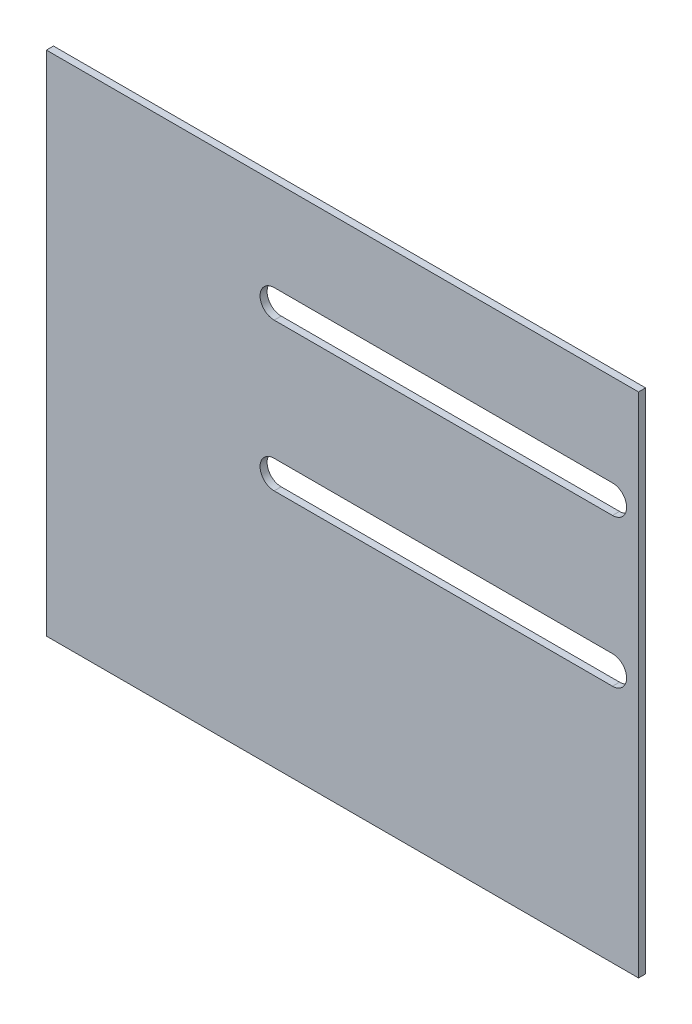
ISO-10303-21;
HEADER;
FILE_DESCRIPTION(('STEP AP214'),'2;1');
FILE_NAME('part.step','',(''),(''),'','','');
FILE_SCHEMA(('AUTOMOTIVE_DESIGN { 1 0 10303 214 1 1 1 1 }'));
ENDSEC;
DATA;
#1=APPLICATION_CONTEXT('core data for automotive mechanical design processes');
#2=APPLICATION_PROTOCOL_DEFINITION('international standard','automotive_design',2000,#1);
#3=PRODUCT_CONTEXT('',#1,'mechanical');
#4=PRODUCT('Part','Part','',(#3));
#5=PRODUCT_RELATED_PRODUCT_CATEGORY('part','',(#4));
#6=PRODUCT_DEFINITION_FORMATION('','',#4);
#7=PRODUCT_DEFINITION_CONTEXT('part definition',#1,'design');
#8=PRODUCT_DEFINITION('design','',#6,#7);
#9=PRODUCT_DEFINITION_SHAPE('','',#8);
#10=(LENGTH_UNIT() NAMED_UNIT(*) SI_UNIT(.MILLI.,.METRE.));
#11=(NAMED_UNIT(*) PLANE_ANGLE_UNIT() SI_UNIT($,.RADIAN.));
#12=(NAMED_UNIT(*) SI_UNIT($,.STERADIAN.) SOLID_ANGLE_UNIT());
#13=UNCERTAINTY_MEASURE_WITH_UNIT(LENGTH_MEASURE(1.E-05),#10,'distance_accuracy_value','');
#14=(GEOMETRIC_REPRESENTATION_CONTEXT(3) GLOBAL_UNCERTAINTY_ASSIGNED_CONTEXT((#13)) GLOBAL_UNIT_ASSIGNED_CONTEXT((#10,
#11,#12)) REPRESENTATION_CONTEXT('',''));
#15=CARTESIAN_POINT('',(0.,0.,0.));
#16=DIRECTION('',(0.,0.,1.));
#17=DIRECTION('',(1.,0.,0.));
#18=AXIS2_PLACEMENT_3D('',#15,#16,#17);
#19=CARTESIAN_POINT('',(0.,0.,6.35));
#20=DIRECTION('',(0.,0.,-1.));
#21=DIRECTION('',(-1.,0.,0.));
#22=AXIS2_PLACEMENT_3D('',#19,#20,#21);
#23=PLANE('',#22);
#24=CARTESIAN_POINT('',(-61.5480475102231,133.202211593084,6.35));
#25=DIRECTION('',(0.,0.,1.));
#26=DIRECTION('',(1.,0.,0.));
#27=AXIS2_PLACEMENT_3D('',#24,#25,#26);
#28=CIRCLE('',#27,12.7);
#29=CARTESIAN_POINT('',(-61.5480475102231,145.902211593084,6.35));
#30=VERTEX_POINT('',#29);
#31=CARTESIAN_POINT('',(-61.5480475102231,120.502211593084,6.35));
#32=VERTEX_POINT('',#31);
#33=EDGE_CURVE('E210',#30,#32,#28,.T.);
#34=ORIENTED_EDGE('',*,*,#33,.F.);
#35=DIRECTION('',(1.,0.,0.));
#36=VECTOR('',#35,1.);
#37=CARTESIAN_POINT('',(-61.5480475102231,145.902211593084,6.35));
#38=LINE('',#37,#36);
#39=CARTESIAN_POINT('',(243.251952489777,145.902211593084,6.35));
#40=VERTEX_POINT('',#39);
#41=EDGE_CURVE('E218',#30,#40,#38,.T.);
#42=ORIENTED_EDGE('',*,*,#41,.T.);
#43=CARTESIAN_POINT('',(243.251952489777,133.202211593084,6.35));
#44=DIRECTION('',(0.,0.,1.));
#45=DIRECTION('',(1.,0.,0.));
#46=AXIS2_PLACEMENT_3D('',#43,#44,#45);
#47=CIRCLE('',#46,12.7);
#48=CARTESIAN_POINT('',(243.251952489777,120.502211593084,6.35));
#49=VERTEX_POINT('',#48);
#50=EDGE_CURVE('E215',#49,#40,#47,.T.);
#51=ORIENTED_EDGE('',*,*,#50,.F.);
#52=DIRECTION('',(1.,0.,0.));
#53=VECTOR('',#52,1.);
#54=CARTESIAN_POINT('',(-61.5480475102231,120.502211593084,6.35));
#55=LINE('',#54,#53);
#56=EDGE_CURVE('E212',#32,#49,#55,.T.);
#57=ORIENTED_EDGE('',*,*,#56,.F.);
#58=EDGE_LOOP('',(#34,#42,#51,#57));
#59=FACE_BOUND('',#58,.T.);
#60=DIRECTION('',(1.,0.,0.));
#61=VECTOR('',#60,1.);
#62=CARTESIAN_POINT('',(-266.7,-228.6,6.35));
#63=LINE('',#62,#61);
#64=CARTESIAN_POINT('',(-266.7,-228.6,6.35));
#65=VERTEX_POINT('',#64);
#66=CARTESIAN_POINT('',(266.7,-228.6,6.35));
#67=VERTEX_POINT('',#66);
#68=EDGE_CURVE('E242',#65,#67,#63,.T.);
#69=ORIENTED_EDGE('',*,*,#68,.T.);
#70=DIRECTION('',(0.,-1.,0.));
#71=VECTOR('',#70,1.);
#72=CARTESIAN_POINT('',(266.7,228.6,6.35));
#73=LINE('',#72,#71);
#74=CARTESIAN_POINT('',(266.7,228.6,6.35));
#75=VERTEX_POINT('',#74);
#76=EDGE_CURVE('E244',#75,#67,#73,.T.);
#77=ORIENTED_EDGE('',*,*,#76,.F.);
#78=DIRECTION('',(1.,0.,0.));
#79=VECTOR('',#78,1.);
#80=CARTESIAN_POINT('',(-266.7,228.6,6.35));
#81=LINE('',#80,#79);
#82=CARTESIAN_POINT('',(-266.7,228.6,6.35));
#83=VERTEX_POINT('',#82);
#84=EDGE_CURVE('E248',#83,#75,#81,.T.);
#85=ORIENTED_EDGE('',*,*,#84,.F.);
#86=DIRECTION('',(0.,-1.,0.));
#87=VECTOR('',#86,1.);
#88=CARTESIAN_POINT('',(-266.7,228.6,6.35));
#89=LINE('',#88,#87);
#90=EDGE_CURVE('E251',#83,#65,#89,.T.);
#91=ORIENTED_EDGE('',*,*,#90,.T.);
#92=EDGE_LOOP('',(#69,#77,#85,#91));
#93=FACE_BOUND('',#92,.T.);
#94=CARTESIAN_POINT('',(-61.5480475102231,0.,6.35));
#95=DIRECTION('',(0.,0.,1.));
#96=DIRECTION('',(1.,0.,0.));
#97=AXIS2_PLACEMENT_3D('',#94,#95,#96);
#98=CIRCLE('',#97,12.7);
#99=CARTESIAN_POINT('',(-61.5480475102231,12.7,6.35));
#100=VERTEX_POINT('',#99);
#101=CARTESIAN_POINT('',(-61.5480475102231,-12.7,6.35));
#102=VERTEX_POINT('',#101);
#103=EDGE_CURVE('E175',#100,#102,#98,.T.);
#104=ORIENTED_EDGE('',*,*,#103,.F.);
#105=DIRECTION('',(1.,0.,0.));
#106=VECTOR('',#105,1.);
#107=CARTESIAN_POINT('',(-61.5480475102231,12.7,6.35));
#108=LINE('',#107,#106);
#109=CARTESIAN_POINT('',(243.251952489777,12.7,6.35));
#110=VERTEX_POINT('',#109);
#111=EDGE_CURVE('E197',#100,#110,#108,.T.);
#112=ORIENTED_EDGE('',*,*,#111,.T.);
#113=CARTESIAN_POINT('',(243.251952489777,0.,6.35));
#114=DIRECTION('',(0.,0.,1.));
#115=DIRECTION('',(1.,0.,0.));
#116=AXIS2_PLACEMENT_3D('',#113,#114,#115);
#117=CIRCLE('',#116,12.7);
#118=CARTESIAN_POINT('',(243.251952489777,-12.7,6.35));
#119=VERTEX_POINT('',#118);
#120=EDGE_CURVE('E195',#119,#110,#117,.T.);
#121=ORIENTED_EDGE('',*,*,#120,.F.);
#122=DIRECTION('',(1.,0.,0.));
#123=VECTOR('',#122,1.);
#124=CARTESIAN_POINT('',(-61.5480475102231,-12.7,6.35));
#125=LINE('',#124,#123);
#126=EDGE_CURVE('E183',#102,#119,#125,.T.);
#127=ORIENTED_EDGE('',*,*,#126,.F.);
#128=EDGE_LOOP('',(#104,#112,#121,#127));
#129=FACE_BOUND('',#128,.T.);
#130=ADVANCED_FACE('F87',(#59,#93,#129),#23,.F.);
#131=CARTESIAN_POINT('',(0.,0.,0.));
#132=DIRECTION('',(0.,0.,-1.));
#133=DIRECTION('',(-1.,0.,0.));
#134=AXIS2_PLACEMENT_3D('',#131,#132,#133);
#135=PLANE('',#134);
#136=DIRECTION('',(1.,0.,0.));
#137=VECTOR('',#136,1.);
#138=CARTESIAN_POINT('',(-266.7,-228.6,0.));
#139=LINE('',#138,#137);
#140=CARTESIAN_POINT('',(-266.7,-228.6,0.));
#141=VERTEX_POINT('',#140);
#142=CARTESIAN_POINT('',(266.7,-228.6,0.));
#143=VERTEX_POINT('',#142);
#144=EDGE_CURVE('E241',#141,#143,#139,.T.);
#145=ORIENTED_EDGE('',*,*,#144,.F.);
#146=DIRECTION('',(0.,-1.,0.));
#147=VECTOR('',#146,1.);
#148=CARTESIAN_POINT('',(-266.7,228.6,0.));
#149=LINE('',#148,#147);
#150=CARTESIAN_POINT('',(-266.7,228.6,0.));
#151=VERTEX_POINT('',#150);
#152=EDGE_CURVE('E245',#151,#141,#149,.T.);
#153=ORIENTED_EDGE('',*,*,#152,.F.);
#154=DIRECTION('',(1.,0.,0.));
#155=VECTOR('',#154,1.);
#156=CARTESIAN_POINT('',(-266.7,228.6,0.));
#157=LINE('',#156,#155);
#158=CARTESIAN_POINT('',(266.7,228.6,0.));
#159=VERTEX_POINT('',#158);
#160=EDGE_CURVE('E259',#151,#159,#157,.T.);
#161=ORIENTED_EDGE('',*,*,#160,.T.);
#162=DIRECTION('',(0.,-1.,0.));
#163=VECTOR('',#162,1.);
#164=CARTESIAN_POINT('',(266.7,228.6,0.));
#165=LINE('',#164,#163);
#166=EDGE_CURVE('E256',#159,#143,#165,.T.);
#167=ORIENTED_EDGE('',*,*,#166,.T.);
#168=EDGE_LOOP('',(#145,#153,#161,#167));
#169=FACE_BOUND('',#168,.T.);
#170=DIRECTION('',(1.,0.,0.));
#171=VECTOR('',#170,1.);
#172=CARTESIAN_POINT('',(-61.5480475102231,145.902211593084,0.));
#173=LINE('',#172,#171);
#174=CARTESIAN_POINT('',(-61.5480475102231,145.902211593084,0.));
#175=VERTEX_POINT('',#174);
#176=CARTESIAN_POINT('',(243.251952489777,145.902211593084,0.));
#177=VERTEX_POINT('',#176);
#178=EDGE_CURVE('E213',#175,#177,#173,.T.);
#179=ORIENTED_EDGE('',*,*,#178,.F.);
#180=CARTESIAN_POINT('',(-61.5480475102231,133.202211593084,0.));
#181=DIRECTION('',(0.,0.,1.));
#182=DIRECTION('',(1.,0.,0.));
#183=AXIS2_PLACEMENT_3D('',#180,#181,#182);
#184=CIRCLE('',#183,12.7);
#185=CARTESIAN_POINT('',(-61.5480475102231,120.502211593084,0.));
#186=VERTEX_POINT('',#185);
#187=EDGE_CURVE('E191',#175,#186,#184,.T.);
#188=ORIENTED_EDGE('',*,*,#187,.T.);
#189=DIRECTION('',(1.,0.,0.));
#190=VECTOR('',#189,1.);
#191=CARTESIAN_POINT('',(-61.5480475102231,120.502211593084,0.));
#192=LINE('',#191,#190);
#193=CARTESIAN_POINT('',(243.251952489777,120.502211593084,0.));
#194=VERTEX_POINT('',#193);
#195=EDGE_CURVE('E224',#186,#194,#192,.T.);
#196=ORIENTED_EDGE('',*,*,#195,.T.);
#197=CARTESIAN_POINT('',(243.251952489777,133.202211593084,0.));
#198=DIRECTION('',(0.,0.,1.));
#199=DIRECTION('',(1.,0.,0.));
#200=AXIS2_PLACEMENT_3D('',#197,#198,#199);
#201=CIRCLE('',#200,12.7);
#202=EDGE_CURVE('E227',#194,#177,#201,.T.);
#203=ORIENTED_EDGE('',*,*,#202,.T.);
#204=EDGE_LOOP('',(#179,#188,#196,#203));
#205=FACE_BOUND('',#204,.T.);
#206=DIRECTION('',(1.,0.,0.));
#207=VECTOR('',#206,1.);
#208=CARTESIAN_POINT('',(-61.5480475102231,12.7,0.));
#209=LINE('',#208,#207);
#210=CARTESIAN_POINT('',(-61.5480475102231,12.7,0.));
#211=VERTEX_POINT('',#210);
#212=CARTESIAN_POINT('',(243.251952489777,12.7,0.));
#213=VERTEX_POINT('',#212);
#214=EDGE_CURVE('E184',#211,#213,#209,.T.);
#215=ORIENTED_EDGE('',*,*,#214,.F.);
#216=CARTESIAN_POINT('',(-61.5480475102231,0.,0.));
#217=DIRECTION('',(0.,0.,1.));
#218=DIRECTION('',(1.,0.,0.));
#219=AXIS2_PLACEMENT_3D('',#216,#217,#218);
#220=CIRCLE('',#219,12.7);
#221=CARTESIAN_POINT('',(-61.5480475102231,-12.7,0.));
#222=VERTEX_POINT('',#221);
#223=EDGE_CURVE('E110',#211,#222,#220,.T.);
#224=ORIENTED_EDGE('',*,*,#223,.T.);
#225=DIRECTION('',(1.,0.,0.));
#226=VECTOR('',#225,1.);
#227=CARTESIAN_POINT('',(-61.5480475102231,-12.7,0.));
#228=LINE('',#227,#226);
#229=CARTESIAN_POINT('',(243.251952489777,-12.7,0.));
#230=VERTEX_POINT('',#229);
#231=EDGE_CURVE('E190',#222,#230,#228,.T.);
#232=ORIENTED_EDGE('',*,*,#231,.T.);
#233=CARTESIAN_POINT('',(243.251952489777,0.,0.));
#234=DIRECTION('',(0.,0.,1.));
#235=DIRECTION('',(1.,0.,0.));
#236=AXIS2_PLACEMENT_3D('',#233,#234,#235);
#237=CIRCLE('',#236,12.7);
#238=EDGE_CURVE('E203',#230,#213,#237,.T.);
#239=ORIENTED_EDGE('',*,*,#238,.T.);
#240=EDGE_LOOP('',(#215,#224,#232,#239));
#241=FACE_BOUND('',#240,.T.);
#242=ADVANCED_FACE('F278',(#169,#205,#241),#135,.T.);
#243=CARTESIAN_POINT('',(-266.7,-228.6,6.35));
#244=DIRECTION('',(0.,1.,0.));
#245=DIRECTION('',(-1.,0.,0.));
#246=AXIS2_PLACEMENT_3D('',#243,#244,#245);
#247=PLANE('',#246);
#248=ORIENTED_EDGE('',*,*,#144,.T.);
#249=DIRECTION('',(0.,0.,-1.));
#250=VECTOR('',#249,1.);
#251=CARTESIAN_POINT('',(266.7,-228.6,6.35));
#252=LINE('',#251,#250);
#253=EDGE_CURVE('E12',#67,#143,#252,.T.);
#254=ORIENTED_EDGE('',*,*,#253,.F.);
#255=ORIENTED_EDGE('',*,*,#68,.F.);
#256=DIRECTION('',(0.,0.,-1.));
#257=VECTOR('',#256,1.);
#258=CARTESIAN_POINT('',(-266.7,-228.6,6.35));
#259=LINE('',#258,#257);
#260=EDGE_CURVE('E253',#65,#141,#259,.T.);
#261=ORIENTED_EDGE('',*,*,#260,.T.);
#262=EDGE_LOOP('',(#248,#254,#255,#261));
#263=FACE_BOUND('',#262,.T.);
#264=ADVANCED_FACE('F89',(#263),#247,.F.);
#265=CARTESIAN_POINT('',(266.7,228.6,6.35));
#266=DIRECTION('',(1.,0.,0.));
#267=DIRECTION('',(0.,1.,0.));
#268=AXIS2_PLACEMENT_3D('',#265,#266,#267);
#269=PLANE('',#268);
#270=ORIENTED_EDGE('',*,*,#166,.F.);
#271=DIRECTION('',(0.,0.,-1.));
#272=VECTOR('',#271,1.);
#273=CARTESIAN_POINT('',(266.7,228.6,6.35));
#274=LINE('',#273,#272);
#275=EDGE_CURVE('E95',#75,#159,#274,.T.);
#276=ORIENTED_EDGE('',*,*,#275,.F.);
#277=ORIENTED_EDGE('',*,*,#76,.T.);
#278=ORIENTED_EDGE('',*,*,#253,.T.);
#279=EDGE_LOOP('',(#270,#276,#277,#278));
#280=FACE_BOUND('',#279,.T.);
#281=ADVANCED_FACE('F273',(#280),#269,.T.);
#282=CARTESIAN_POINT('',(-266.7,228.6,6.35));
#283=DIRECTION('',(0.,1.,0.));
#284=DIRECTION('',(-1.,0.,0.));
#285=AXIS2_PLACEMENT_3D('',#282,#283,#284);
#286=PLANE('',#285);
#287=ORIENTED_EDGE('',*,*,#160,.F.);
#288=DIRECTION('',(0.,0.,-1.));
#289=VECTOR('',#288,1.);
#290=CARTESIAN_POINT('',(-266.7,228.6,6.35));
#291=LINE('',#290,#289);
#292=EDGE_CURVE('E265',#83,#151,#291,.T.);
#293=ORIENTED_EDGE('',*,*,#292,.F.);
#294=ORIENTED_EDGE('',*,*,#84,.T.);
#295=ORIENTED_EDGE('',*,*,#275,.T.);
#296=EDGE_LOOP('',(#287,#293,#294,#295));
#297=FACE_BOUND('',#296,.T.);
#298=ADVANCED_FACE('F269',(#297),#286,.T.);
#299=CARTESIAN_POINT('',(-266.7,228.6,6.35));
#300=DIRECTION('',(1.,0.,0.));
#301=DIRECTION('',(0.,1.,0.));
#302=AXIS2_PLACEMENT_3D('',#299,#300,#301);
#303=PLANE('',#302);
#304=ORIENTED_EDGE('',*,*,#152,.T.);
#305=ORIENTED_EDGE('',*,*,#260,.F.);
#306=ORIENTED_EDGE('',*,*,#90,.F.);
#307=ORIENTED_EDGE('',*,*,#292,.T.);
#308=EDGE_LOOP('',(#304,#305,#306,#307));
#309=FACE_BOUND('',#308,.T.);
#310=ADVANCED_FACE('F282',(#309),#303,.F.);
#311=CARTESIAN_POINT('',(-61.5480475102231,133.202211593084,6.35));
#312=DIRECTION('',(0.,0.,-1.));
#313=DIRECTION('',(-1.,0.,0.));
#314=AXIS2_PLACEMENT_3D('',#311,#312,#313);
#315=CYLINDRICAL_SURFACE('',#314,12.7);
#316=ORIENTED_EDGE('',*,*,#187,.F.);
#317=DIRECTION('',(0.,0.,-1.));
#318=VECTOR('',#317,1.);
#319=CARTESIAN_POINT('',(-61.5480475102231,145.902211593084,6.35));
#320=LINE('',#319,#318);
#321=EDGE_CURVE('E221',#30,#175,#320,.T.);
#322=ORIENTED_EDGE('',*,*,#321,.F.);
#323=ORIENTED_EDGE('',*,*,#33,.T.);
#324=DIRECTION('',(0.,0.,-1.));
#325=VECTOR('',#324,1.);
#326=CARTESIAN_POINT('',(-61.5480475102231,120.502211593084,6.35));
#327=LINE('',#326,#325);
#328=EDGE_CURVE('E238',#32,#186,#327,.T.);
#329=ORIENTED_EDGE('',*,*,#328,.T.);
#330=EDGE_LOOP('',(#316,#322,#323,#329));
#331=FACE_BOUND('',#330,.T.);
#332=ADVANCED_FACE('F296',(#331),#315,.F.);
#333=CARTESIAN_POINT('',(-61.5480475102231,120.502211593084,6.35));
#334=DIRECTION('',(0.,1.,0.));
#335=DIRECTION('',(0.,0.,1.));
#336=AXIS2_PLACEMENT_3D('',#333,#334,#335);
#337=PLANE('',#336);
#338=ORIENTED_EDGE('',*,*,#195,.F.);
#339=ORIENTED_EDGE('',*,*,#328,.F.);
#340=ORIENTED_EDGE('',*,*,#56,.T.);
#341=DIRECTION('',(0.,0.,-1.));
#342=VECTOR('',#341,1.);
#343=CARTESIAN_POINT('',(243.251952489777,120.502211593084,6.35));
#344=LINE('',#343,#342);
#345=EDGE_CURVE('E236',#49,#194,#344,.T.);
#346=ORIENTED_EDGE('',*,*,#345,.T.);
#347=EDGE_LOOP('',(#338,#339,#340,#346));
#348=FACE_BOUND('',#347,.T.);
#349=ADVANCED_FACE('F341',(#348),#337,.T.);
#350=CARTESIAN_POINT('',(243.251952489777,133.202211593084,6.35));
#351=DIRECTION('',(0.,0.,-1.));
#352=DIRECTION('',(-1.,0.,0.));
#353=AXIS2_PLACEMENT_3D('',#350,#351,#352);
#354=CYLINDRICAL_SURFACE('',#353,12.7);
#355=ORIENTED_EDGE('',*,*,#202,.F.);
#356=ORIENTED_EDGE('',*,*,#345,.F.);
#357=ORIENTED_EDGE('',*,*,#50,.T.);
#358=DIRECTION('',(0.,0.,-1.));
#359=VECTOR('',#358,1.);
#360=CARTESIAN_POINT('',(243.251952489777,145.902211593084,6.35));
#361=LINE('',#360,#359);
#362=EDGE_CURVE('E234',#40,#177,#361,.T.);
#363=ORIENTED_EDGE('',*,*,#362,.T.);
#364=EDGE_LOOP('',(#355,#356,#357,#363));
#365=FACE_BOUND('',#364,.T.);
#366=ADVANCED_FACE('F349',(#365),#354,.F.);
#367=CARTESIAN_POINT('',(-61.5480475102231,145.902211593084,6.35));
#368=DIRECTION('',(0.,1.,0.));
#369=DIRECTION('',(0.,0.,1.));
#370=AXIS2_PLACEMENT_3D('',#367,#368,#369);
#371=PLANE('',#370);
#372=ORIENTED_EDGE('',*,*,#178,.T.);
#373=ORIENTED_EDGE('',*,*,#362,.F.);
#374=ORIENTED_EDGE('',*,*,#41,.F.);
#375=ORIENTED_EDGE('',*,*,#321,.T.);
#376=EDGE_LOOP('',(#372,#373,#374,#375));
#377=FACE_BOUND('',#376,.T.);
#378=ADVANCED_FACE('F357',(#377),#371,.F.);
#379=CARTESIAN_POINT('',(-61.5480475102231,0.,6.35));
#380=DIRECTION('',(0.,0.,-1.));
#381=DIRECTION('',(-1.,0.,0.));
#382=AXIS2_PLACEMENT_3D('',#379,#380,#381);
#383=CYLINDRICAL_SURFACE('',#382,12.7);
#384=ORIENTED_EDGE('',*,*,#223,.F.);
#385=DIRECTION('',(0.,0.,-1.));
#386=VECTOR('',#385,1.);
#387=CARTESIAN_POINT('',(-61.5480475102231,12.7,6.35));
#388=LINE('',#387,#386);
#389=EDGE_CURVE('E179',#100,#211,#388,.T.);
#390=ORIENTED_EDGE('',*,*,#389,.F.);
#391=ORIENTED_EDGE('',*,*,#103,.T.);
#392=DIRECTION('',(0.,0.,-1.));
#393=VECTOR('',#392,1.);
#394=CARTESIAN_POINT('',(-61.5480475102231,-12.7,6.35));
#395=LINE('',#394,#393);
#396=EDGE_CURVE('E178',#102,#222,#395,.T.);
#397=ORIENTED_EDGE('',*,*,#396,.T.);
#398=EDGE_LOOP('',(#384,#390,#391,#397));
#399=FACE_BOUND('',#398,.T.);
#400=ADVANCED_FACE('F177',(#399),#383,.F.);
#401=CARTESIAN_POINT('',(-61.5480475102231,-12.7,6.35));
#402=DIRECTION('',(0.,1.,0.));
#403=DIRECTION('',(-1.,0.,0.));
#404=AXIS2_PLACEMENT_3D('',#401,#402,#403);
#405=PLANE('',#404);
#406=ORIENTED_EDGE('',*,*,#231,.F.);
#407=ORIENTED_EDGE('',*,*,#396,.F.);
#408=ORIENTED_EDGE('',*,*,#126,.T.);
#409=DIRECTION('',(0.,0.,-1.));
#410=VECTOR('',#409,1.);
#411=CARTESIAN_POINT('',(243.251952489777,-12.7,6.35));
#412=LINE('',#411,#410);
#413=EDGE_CURVE('E192',#119,#230,#412,.T.);
#414=ORIENTED_EDGE('',*,*,#413,.T.);
#415=EDGE_LOOP('',(#406,#407,#408,#414));
#416=FACE_BOUND('',#415,.T.);
#417=ADVANCED_FACE('F187',(#416),#405,.T.);
#418=CARTESIAN_POINT('',(243.251952489777,0.,6.35));
#419=DIRECTION('',(0.,0.,-1.));
#420=DIRECTION('',(-1.,0.,0.));
#421=AXIS2_PLACEMENT_3D('',#418,#419,#420);
#422=CYLINDRICAL_SURFACE('',#421,12.7);
#423=ORIENTED_EDGE('',*,*,#238,.F.);
#424=ORIENTED_EDGE('',*,*,#413,.F.);
#425=ORIENTED_EDGE('',*,*,#120,.T.);
#426=DIRECTION('',(0.,0.,-1.));
#427=VECTOR('',#426,1.);
#428=CARTESIAN_POINT('',(243.251952489777,12.7,6.35));
#429=LINE('',#428,#427);
#430=EDGE_CURVE('E102',#110,#213,#429,.T.);
#431=ORIENTED_EDGE('',*,*,#430,.T.);
#432=EDGE_LOOP('',(#423,#424,#425,#431));
#433=FACE_BOUND('',#432,.T.);
#434=ADVANCED_FACE('F381',(#433),#422,.F.);
#435=CARTESIAN_POINT('',(-61.5480475102231,12.7,6.35));
#436=DIRECTION('',(0.,1.,0.));
#437=DIRECTION('',(-1.,0.,0.));
#438=AXIS2_PLACEMENT_3D('',#435,#436,#437);
#439=PLANE('',#438);
#440=ORIENTED_EDGE('',*,*,#214,.T.);
#441=ORIENTED_EDGE('',*,*,#430,.F.);
#442=ORIENTED_EDGE('',*,*,#111,.F.);
#443=ORIENTED_EDGE('',*,*,#389,.T.);
#444=EDGE_LOOP('',(#440,#441,#442,#443));
#445=FACE_BOUND('',#444,.T.);
#446=ADVANCED_FACE('F389',(#445),#439,.F.);
#447=CLOSED_SHELL('',(#130,#242,#264,#281,#298,#310,#332,#349,#366,#378,#400,#417,#434,#446));
#448=MANIFOLD_SOLID_BREP('B2',#447);
#449=ADVANCED_BREP_SHAPE_REPRESENTATION('',(#18,#448),#14);
#450=SHAPE_DEFINITION_REPRESENTATION(#9,#449);
ENDSEC;
END-ISO-10303-21;
